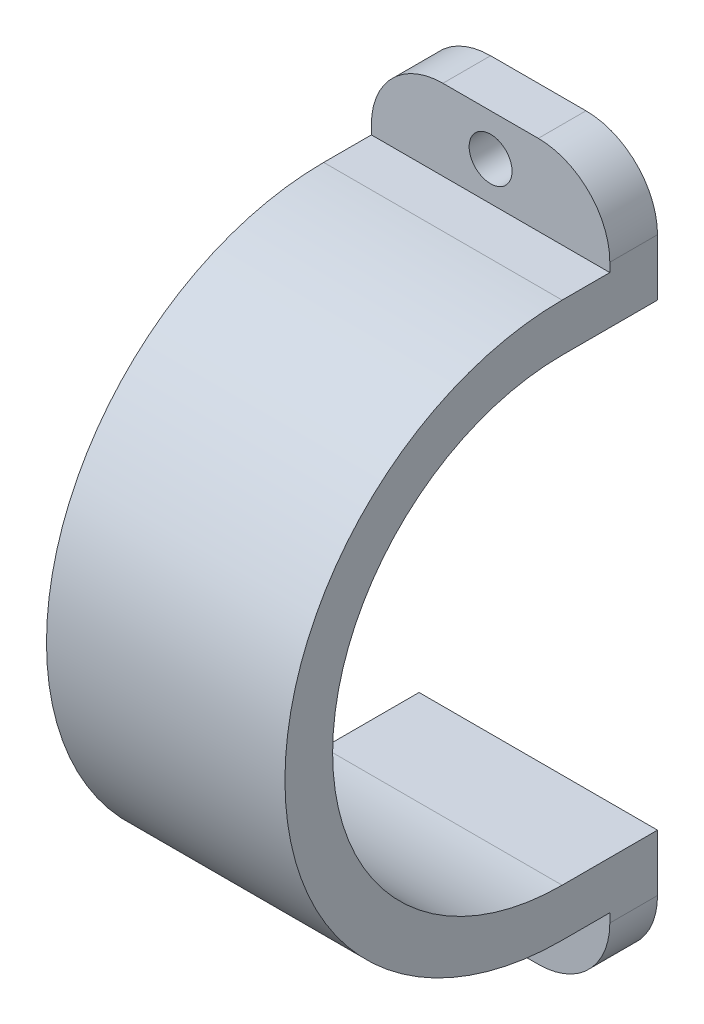
ISO-10303-21;
HEADER;
FILE_DESCRIPTION(('STEP AP214'),'2;1');
FILE_NAME('part.step','',(''),(''),'','','');
FILE_SCHEMA(('AUTOMOTIVE_DESIGN { 1 0 10303 214 1 1 1 1 }'));
ENDSEC;
DATA;
#1=APPLICATION_CONTEXT('core data for automotive mechanical design processes');
#2=APPLICATION_PROTOCOL_DEFINITION('international standard','automotive_design',2000,#1);
#3=PRODUCT_CONTEXT('',#1,'mechanical');
#4=PRODUCT('Part','Part','',(#3));
#5=PRODUCT_RELATED_PRODUCT_CATEGORY('part','',(#4));
#6=PRODUCT_DEFINITION_FORMATION('','',#4);
#7=PRODUCT_DEFINITION_CONTEXT('part definition',#1,'design');
#8=PRODUCT_DEFINITION('design','',#6,#7);
#9=PRODUCT_DEFINITION_SHAPE('','',#8);
#10=(LENGTH_UNIT() NAMED_UNIT(*) SI_UNIT(.MILLI.,.METRE.));
#11=(NAMED_UNIT(*) PLANE_ANGLE_UNIT() SI_UNIT($,.RADIAN.));
#12=(NAMED_UNIT(*) SI_UNIT($,.STERADIAN.) SOLID_ANGLE_UNIT());
#13=UNCERTAINTY_MEASURE_WITH_UNIT(LENGTH_MEASURE(1.E-05),#10,'distance_accuracy_value','');
#14=(GEOMETRIC_REPRESENTATION_CONTEXT(3) GLOBAL_UNCERTAINTY_ASSIGNED_CONTEXT((#13)) GLOBAL_UNIT_ASSIGNED_CONTEXT((#10,
#11,#12)) REPRESENTATION_CONTEXT('',''));
#15=CARTESIAN_POINT('',(0.,0.,0.));
#16=DIRECTION('',(0.,0.,1.));
#17=DIRECTION('',(1.,0.,0.));
#18=AXIS2_PLACEMENT_3D('',#15,#16,#17);
#19=CARTESIAN_POINT('',(20.,23.25,29.5));
#20=DIRECTION('',(0.,0.,-1.));
#21=DIRECTION('',(0.,1.,0.));
#22=AXIS2_PLACEMENT_3D('',#19,#20,#21);
#23=PLANE('',#22);
#24=DIRECTION('',(0.,-1.,0.));
#25=VECTOR('',#24,1.);
#26=CARTESIAN_POINT('',(20.,23.25,29.5));
#27=LINE('',#26,#25);
#28=CARTESIAN_POINT('',(20.,24.,29.5));
#29=VERTEX_POINT('',#28);
#30=CARTESIAN_POINT('',(20.,23.25,29.5));
#31=VERTEX_POINT('',#30);
#32=EDGE_CURVE('E161',#29,#31,#27,.T.);
#33=ORIENTED_EDGE('',*,*,#32,.F.);
#34=CARTESIAN_POINT('',(14.,24.,29.5));
#35=DIRECTION('',(0.,0.,-1.));
#36=DIRECTION('',(0.,1.,0.));
#37=AXIS2_PLACEMENT_3D('',#34,#35,#36);
#38=CIRCLE('',#37,6.);
#39=CARTESIAN_POINT('',(14.,30.,29.5));
#40=VERTEX_POINT('',#39);
#41=EDGE_CURVE('E201',#29,#40,#38,.F.);
#42=ORIENTED_EDGE('',*,*,#41,.T.);
#43=DIRECTION('',(-1.,0.,0.));
#44=VECTOR('',#43,1.);
#45=CARTESIAN_POINT('',(20.,30.,29.5));
#46=LINE('',#45,#44);
#47=CARTESIAN_POINT('',(6.,30.,29.5));
#48=VERTEX_POINT('',#47);
#49=EDGE_CURVE('E287',#40,#48,#46,.T.);
#50=ORIENTED_EDGE('',*,*,#49,.T.);
#51=CARTESIAN_POINT('',(6.,24.,29.5));
#52=DIRECTION('',(0.,0.,-1.));
#53=DIRECTION('',(0.,1.,0.));
#54=AXIS2_PLACEMENT_3D('',#51,#52,#53);
#55=CIRCLE('',#54,6.);
#56=CARTESIAN_POINT('',(0.,24.,29.5));
#57=VERTEX_POINT('',#56);
#58=EDGE_CURVE('E198',#48,#57,#55,.F.);
#59=ORIENTED_EDGE('',*,*,#58,.T.);
#60=DIRECTION('',(0.,-1.,0.));
#61=VECTOR('',#60,1.);
#62=CARTESIAN_POINT('',(0.,23.25,29.5));
#63=LINE('',#62,#61);
#64=CARTESIAN_POINT('',(0.,23.25,29.5));
#65=VERTEX_POINT('',#64);
#66=EDGE_CURVE('E184',#57,#65,#63,.T.);
#67=ORIENTED_EDGE('',*,*,#66,.T.);
#68=DIRECTION('',(-1.,0.,0.));
#69=VECTOR('',#68,1.);
#70=CARTESIAN_POINT('',(20.,23.25,29.5));
#71=LINE('',#70,#69);
#72=EDGE_CURVE('E176',#31,#65,#71,.T.);
#73=ORIENTED_EDGE('',*,*,#72,.F.);
#74=EDGE_LOOP('',(#33,#42,#50,#59,#67,#73));
#75=FACE_BOUND('',#74,.T.);
#76=CARTESIAN_POINT('',(10.,26.5,29.5));
#77=DIRECTION('',(0.,0.,1.));
#78=DIRECTION('',(1.,0.,0.));
#79=AXIS2_PLACEMENT_3D('',#76,#77,#78);
#80=CIRCLE('',#79,1.8);
#81=CARTESIAN_POINT('',(11.8,26.5,29.5));
#82=VERTEX_POINT('',#81);
#83=EDGE_CURVE('E511',#82,#82,#80,.T.);
#84=ORIENTED_EDGE('',*,*,#83,.F.);
#85=EDGE_LOOP('',(#84));
#86=FACE_BOUND('',#85,.T.);
#87=ADVANCED_FACE('F41',(#75,#86),#23,.F.);
#88=CARTESIAN_POINT('',(20.,23.25,33.5));
#89=DIRECTION('',(0.,-1.,0.));
#90=DIRECTION('',(0.,0.,-1.));
#91=AXIS2_PLACEMENT_3D('',#88,#89,#90);
#92=PLANE('',#91);
#93=DIRECTION('',(0.,0.,1.));
#94=VECTOR('',#93,1.);
#95=CARTESIAN_POINT('',(0.,23.25,33.5));
#96=LINE('',#95,#94);
#97=CARTESIAN_POINT('',(0.,23.25,33.5));
#98=VERTEX_POINT('',#97);
#99=EDGE_CURVE('E272',#65,#98,#96,.T.);
#100=ORIENTED_EDGE('',*,*,#99,.T.);
#101=DIRECTION('',(-1.,0.,0.));
#102=VECTOR('',#101,1.);
#103=CARTESIAN_POINT('',(20.,23.25,33.5));
#104=LINE('',#103,#102);
#105=CARTESIAN_POINT('',(20.,23.25,33.5));
#106=VERTEX_POINT('',#105);
#107=EDGE_CURVE('E178',#106,#98,#104,.T.);
#108=ORIENTED_EDGE('',*,*,#107,.F.);
#109=DIRECTION('',(0.,0.,1.));
#110=VECTOR('',#109,1.);
#111=CARTESIAN_POINT('',(20.,23.25,33.5));
#112=LINE('',#111,#110);
#113=EDGE_CURVE('E165',#31,#106,#112,.T.);
#114=ORIENTED_EDGE('',*,*,#113,.F.);
#115=ORIENTED_EDGE('',*,*,#72,.T.);
#116=EDGE_LOOP('',(#100,#108,#114,#115));
#117=FACE_BOUND('',#116,.T.);
#118=ADVANCED_FACE('F175',(#117),#92,.F.);
#119=CARTESIAN_POINT('',(20.,0.,33.5));
#120=DIRECTION('',(-1.,0.,0.));
#121=DIRECTION('',(0.,0.,1.));
#122=AXIS2_PLACEMENT_3D('',#119,#120,#121);
#123=CYLINDRICAL_SURFACE('',#122,23.25);
#124=CARTESIAN_POINT('',(0.,0.,33.5));
#125=DIRECTION('',(1.,0.,0.));
#126=DIRECTION('',(0.,0.,1.));
#127=AXIS2_PLACEMENT_3D('',#124,#125,#126);
#128=CIRCLE('',#127,23.25);
#129=CARTESIAN_POINT('',(0.,-23.25,33.5));
#130=VERTEX_POINT('',#129);
#131=EDGE_CURVE('E267',#98,#130,#128,.T.);
#132=ORIENTED_EDGE('',*,*,#131,.T.);
#133=DIRECTION('',(-1.,0.,0.));
#134=VECTOR('',#133,1.);
#135=CARTESIAN_POINT('',(20.,-23.25,33.5));
#136=LINE('',#135,#134);
#137=CARTESIAN_POINT('',(20.,-23.25,33.5));
#138=VERTEX_POINT('',#137);
#139=EDGE_CURVE('E193',#138,#130,#136,.T.);
#140=ORIENTED_EDGE('',*,*,#139,.F.);
#141=CARTESIAN_POINT('',(20.,0.,33.5));
#142=DIRECTION('',(1.,0.,0.));
#143=DIRECTION('',(0.,0.,1.));
#144=AXIS2_PLACEMENT_3D('',#141,#142,#143);
#145=CIRCLE('',#144,23.25);
#146=EDGE_CURVE('E180',#106,#138,#145,.T.);
#147=ORIENTED_EDGE('',*,*,#146,.F.);
#148=ORIENTED_EDGE('',*,*,#107,.T.);
#149=EDGE_LOOP('',(#132,#140,#147,#148));
#150=FACE_BOUND('',#149,.T.);
#151=ADVANCED_FACE('F334',(#150),#123,.T.);
#152=CARTESIAN_POINT('',(20.,-23.25,33.5));
#153=DIRECTION('',(0.,1.,0.));
#154=DIRECTION('',(0.,0.,1.));
#155=AXIS2_PLACEMENT_3D('',#152,#153,#154);
#156=PLANE('',#155);
#157=DIRECTION('',(0.,0.,-1.));
#158=VECTOR('',#157,1.);
#159=CARTESIAN_POINT('',(0.,-23.25,33.5));
#160=LINE('',#159,#158);
#161=CARTESIAN_POINT('',(0.,-23.25,29.5));
#162=VERTEX_POINT('',#161);
#163=EDGE_CURVE('E261',#130,#162,#160,.T.);
#164=ORIENTED_EDGE('',*,*,#163,.T.);
#165=DIRECTION('',(-1.,0.,0.));
#166=VECTOR('',#165,1.);
#167=CARTESIAN_POINT('',(20.,-23.25,29.5));
#168=LINE('',#167,#166);
#169=CARTESIAN_POINT('',(20.,-23.25,29.5));
#170=VERTEX_POINT('',#169);
#171=EDGE_CURVE('E249',#170,#162,#168,.T.);
#172=ORIENTED_EDGE('',*,*,#171,.F.);
#173=DIRECTION('',(0.,0.,-1.));
#174=VECTOR('',#173,1.);
#175=CARTESIAN_POINT('',(20.,-23.25,33.5));
#176=LINE('',#175,#174);
#177=EDGE_CURVE('E236',#138,#170,#176,.T.);
#178=ORIENTED_EDGE('',*,*,#177,.F.);
#179=ORIENTED_EDGE('',*,*,#139,.T.);
#180=EDGE_LOOP('',(#164,#172,#178,#179));
#181=FACE_BOUND('',#180,.T.);
#182=ADVANCED_FACE('F260',(#181),#156,.F.);
#183=CARTESIAN_POINT('',(20.,-23.25,29.5));
#184=DIRECTION('',(0.,0.,-1.));
#185=DIRECTION('',(0.,1.,0.));
#186=AXIS2_PLACEMENT_3D('',#183,#184,#185);
#187=PLANE('',#186);
#188=CARTESIAN_POINT('',(10.,-26.5,29.5));
#189=DIRECTION('',(0.,0.,1.));
#190=DIRECTION('',(1.,0.,0.));
#191=AXIS2_PLACEMENT_3D('',#188,#189,#190);
#192=CIRCLE('',#191,1.8);
#193=CARTESIAN_POINT('',(11.8,-26.5,29.5));
#194=VERTEX_POINT('',#193);
#195=EDGE_CURVE('E505',#194,#194,#192,.T.);
#196=ORIENTED_EDGE('',*,*,#195,.F.);
#197=EDGE_LOOP('',(#196));
#198=FACE_BOUND('',#197,.T.);
#199=DIRECTION('',(0.,-1.,0.));
#200=VECTOR('',#199,1.);
#201=CARTESIAN_POINT('',(0.,-23.25,29.5));
#202=LINE('',#201,#200);
#203=CARTESIAN_POINT('',(0.,-24.,29.5));
#204=VERTEX_POINT('',#203);
#205=EDGE_CURVE('E268',#162,#204,#202,.T.);
#206=ORIENTED_EDGE('',*,*,#205,.T.);
#207=CARTESIAN_POINT('',(6.,-24.,29.5));
#208=DIRECTION('',(0.,0.,-1.));
#209=DIRECTION('',(0.,1.,0.));
#210=AXIS2_PLACEMENT_3D('',#207,#208,#209);
#211=CIRCLE('',#210,6.);
#212=CARTESIAN_POINT('',(6.,-30.,29.5));
#213=VERTEX_POINT('',#212);
#214=EDGE_CURVE('E11',#204,#213,#211,.F.);
#215=ORIENTED_EDGE('',*,*,#214,.T.);
#216=DIRECTION('',(-1.,0.,0.));
#217=VECTOR('',#216,1.);
#218=CARTESIAN_POINT('',(20.,-30.,29.5));
#219=LINE('',#218,#217);
#220=CARTESIAN_POINT('',(14.,-30.,29.5));
#221=VERTEX_POINT('',#220);
#222=EDGE_CURVE('E231',#221,#213,#219,.T.);
#223=ORIENTED_EDGE('',*,*,#222,.F.);
#224=CARTESIAN_POINT('',(14.,-24.,29.5));
#225=DIRECTION('',(0.,0.,-1.));
#226=DIRECTION('',(0.,1.,0.));
#227=AXIS2_PLACEMENT_3D('',#224,#225,#226);
#228=CIRCLE('',#227,6.);
#229=CARTESIAN_POINT('',(20.,-24.,29.5));
#230=VERTEX_POINT('',#229);
#231=EDGE_CURVE('E49',#221,#230,#228,.F.);
#232=ORIENTED_EDGE('',*,*,#231,.T.);
#233=DIRECTION('',(0.,-1.,0.));
#234=VECTOR('',#233,1.);
#235=CARTESIAN_POINT('',(20.,-23.25,29.5));
#236=LINE('',#235,#234);
#237=EDGE_CURVE('E230',#170,#230,#236,.T.);
#238=ORIENTED_EDGE('',*,*,#237,.F.);
#239=ORIENTED_EDGE('',*,*,#171,.T.);
#240=EDGE_LOOP('',(#206,#215,#223,#232,#238,#239));
#241=FACE_BOUND('',#240,.T.);
#242=ADVANCED_FACE('F228',(#198,#241),#187,.F.);
#243=CARTESIAN_POINT('',(20.,-30.,29.5));
#244=DIRECTION('',(0.,1.,0.));
#245=DIRECTION('',(0.,0.,1.));
#246=AXIS2_PLACEMENT_3D('',#243,#244,#245);
#247=PLANE('',#246);
#248=ORIENTED_EDGE('',*,*,#222,.T.);
#249=DIRECTION('',(0.,0.,-1.));
#250=VECTOR('',#249,1.);
#251=CARTESIAN_POINT('',(6.,-30.,29.5));
#252=LINE('',#251,#250);
#253=CARTESIAN_POINT('',(6.,-30.,25.5));
#254=VERTEX_POINT('',#253);
#255=EDGE_CURVE('E219',#213,#254,#252,.T.);
#256=ORIENTED_EDGE('',*,*,#255,.T.);
#257=DIRECTION('',(-1.,0.,0.));
#258=VECTOR('',#257,1.);
#259=CARTESIAN_POINT('',(20.,-30.,25.5));
#260=LINE('',#259,#258);
#261=CARTESIAN_POINT('',(14.,-30.,25.5));
#262=VERTEX_POINT('',#261);
#263=EDGE_CURVE('E243',#262,#254,#260,.T.);
#264=ORIENTED_EDGE('',*,*,#263,.F.);
#265=DIRECTION('',(0.,0.,-1.));
#266=VECTOR('',#265,1.);
#267=CARTESIAN_POINT('',(14.,-30.,29.5));
#268=LINE('',#267,#266);
#269=EDGE_CURVE('E61',#262,#221,#268,.F.);
#270=ORIENTED_EDGE('',*,*,#269,.T.);
#271=EDGE_LOOP('',(#248,#256,#264,#270));
#272=FACE_BOUND('',#271,.T.);
#273=ADVANCED_FACE('F245',(#272),#247,.F.);
#274=CARTESIAN_POINT('',(20.,-30.,25.5));
#275=DIRECTION('',(0.,0.,1.));
#276=DIRECTION('',(0.,-1.,0.));
#277=AXIS2_PLACEMENT_3D('',#274,#275,#276);
#278=PLANE('',#277);
#279=CARTESIAN_POINT('',(10.,-26.5,25.5));
#280=DIRECTION('',(0.,0.,1.));
#281=DIRECTION('',(0.,-1.,0.));
#282=AXIS2_PLACEMENT_3D('',#279,#280,#281);
#283=CIRCLE('',#282,1.8);
#284=CARTESIAN_POINT('',(10.,-28.3,25.5));
#285=VERTEX_POINT('',#284);
#286=EDGE_CURVE('E333',#285,#285,#283,.T.);
#287=ORIENTED_EDGE('',*,*,#286,.T.);
#288=EDGE_LOOP('',(#287));
#289=FACE_BOUND('',#288,.T.);
#290=ORIENTED_EDGE('',*,*,#263,.T.);
#291=CARTESIAN_POINT('',(6.,-24.,25.5));
#292=DIRECTION('',(0.,0.,1.));
#293=DIRECTION('',(0.,-1.,0.));
#294=AXIS2_PLACEMENT_3D('',#291,#292,#293);
#295=CIRCLE('',#294,6.);
#296=CARTESIAN_POINT('',(0.,-24.,25.5));
#297=VERTEX_POINT('',#296);
#298=EDGE_CURVE('E224',#254,#297,#295,.F.);
#299=ORIENTED_EDGE('',*,*,#298,.T.);
#300=DIRECTION('',(0.,1.,0.));
#301=VECTOR('',#300,1.);
#302=CARTESIAN_POINT('',(0.,-30.,25.5));
#303=LINE('',#302,#301);
#304=CARTESIAN_POINT('',(0.,-19.25,25.5));
#305=VERTEX_POINT('',#304);
#306=EDGE_CURVE('E270',#297,#305,#303,.T.);
#307=ORIENTED_EDGE('',*,*,#306,.T.);
#308=DIRECTION('',(-1.,0.,0.));
#309=VECTOR('',#308,1.);
#310=CARTESIAN_POINT('',(20.,-19.25,25.5));
#311=LINE('',#310,#309);
#312=CARTESIAN_POINT('',(20.,-19.25,25.5));
#313=VERTEX_POINT('',#312);
#314=EDGE_CURVE('E247',#313,#305,#311,.T.);
#315=ORIENTED_EDGE('',*,*,#314,.F.);
#316=DIRECTION('',(0.,1.,0.));
#317=VECTOR('',#316,1.);
#318=CARTESIAN_POINT('',(20.,-30.,25.5));
#319=LINE('',#318,#317);
#320=CARTESIAN_POINT('',(20.,-24.,25.5));
#321=VERTEX_POINT('',#320);
#322=EDGE_CURVE('E238',#321,#313,#319,.T.);
#323=ORIENTED_EDGE('',*,*,#322,.F.);
#324=CARTESIAN_POINT('',(14.,-24.,25.5));
#325=DIRECTION('',(0.,0.,1.));
#326=DIRECTION('',(0.,-1.,0.));
#327=AXIS2_PLACEMENT_3D('',#324,#325,#326);
#328=CIRCLE('',#327,6.);
#329=EDGE_CURVE('E222',#321,#262,#328,.F.);
#330=ORIENTED_EDGE('',*,*,#329,.T.);
#331=EDGE_LOOP('',(#290,#299,#307,#315,#323,#330));
#332=FACE_BOUND('',#331,.T.);
#333=ADVANCED_FACE('F242',(#289,#332),#278,.F.);
#334=CARTESIAN_POINT('',(20.,-19.25,25.5));
#335=DIRECTION('',(0.,-1.,0.));
#336=DIRECTION('',(0.,0.,-1.));
#337=AXIS2_PLACEMENT_3D('',#334,#335,#336);
#338=PLANE('',#337);
#339=DIRECTION('',(0.,0.,1.));
#340=VECTOR('',#339,1.);
#341=CARTESIAN_POINT('',(0.,-19.25,25.5));
#342=LINE('',#341,#340);
#343=CARTESIAN_POINT('',(0.,-19.25,33.5));
#344=VERTEX_POINT('',#343);
#345=EDGE_CURVE('E277',#305,#344,#342,.T.);
#346=ORIENTED_EDGE('',*,*,#345,.T.);
#347=DIRECTION('',(-1.,0.,0.));
#348=VECTOR('',#347,1.);
#349=CARTESIAN_POINT('',(20.,-19.25,33.5));
#350=LINE('',#349,#348);
#351=CARTESIAN_POINT('',(20.,-19.25,33.5));
#352=VERTEX_POINT('',#351);
#353=EDGE_CURVE('E252',#352,#344,#350,.T.);
#354=ORIENTED_EDGE('',*,*,#353,.F.);
#355=DIRECTION('',(0.,0.,1.));
#356=VECTOR('',#355,1.);
#357=CARTESIAN_POINT('',(20.,-19.25,25.5));
#358=LINE('',#357,#356);
#359=EDGE_CURVE('E339',#313,#352,#358,.T.);
#360=ORIENTED_EDGE('',*,*,#359,.F.);
#361=ORIENTED_EDGE('',*,*,#314,.T.);
#362=EDGE_LOOP('',(#346,#354,#360,#361));
#363=FACE_BOUND('',#362,.T.);
#364=ADVANCED_FACE('F341',(#363),#338,.F.);
#365=CARTESIAN_POINT('',(20.,0.,33.5));
#366=DIRECTION('',(-1.,0.,0.));
#367=DIRECTION('',(0.,0.,1.));
#368=AXIS2_PLACEMENT_3D('',#365,#366,#367);
#369=CYLINDRICAL_SURFACE('',#368,19.25);
#370=CARTESIAN_POINT('',(0.,0.,33.5));
#371=DIRECTION('',(-1.,0.,0.));
#372=DIRECTION('',(0.,0.,-1.));
#373=AXIS2_PLACEMENT_3D('',#370,#371,#372);
#374=CIRCLE('',#373,19.25);
#375=CARTESIAN_POINT('',(0.,19.25,33.5));
#376=VERTEX_POINT('',#375);
#377=EDGE_CURVE('E279',#344,#376,#374,.T.);
#378=ORIENTED_EDGE('',*,*,#377,.T.);
#379=DIRECTION('',(-1.,0.,0.));
#380=VECTOR('',#379,1.);
#381=CARTESIAN_POINT('',(20.,19.25,33.5));
#382=LINE('',#381,#380);
#383=CARTESIAN_POINT('',(20.,19.25,33.5));
#384=VERTEX_POINT('',#383);
#385=EDGE_CURVE('E298',#384,#376,#382,.T.);
#386=ORIENTED_EDGE('',*,*,#385,.F.);
#387=CARTESIAN_POINT('',(20.,0.,33.5));
#388=DIRECTION('',(-1.,0.,0.));
#389=DIRECTION('',(0.,0.,-1.));
#390=AXIS2_PLACEMENT_3D('',#387,#388,#389);
#391=CIRCLE('',#390,19.25);
#392=EDGE_CURVE('E308',#352,#384,#391,.T.);
#393=ORIENTED_EDGE('',*,*,#392,.F.);
#394=ORIENTED_EDGE('',*,*,#353,.T.);
#395=EDGE_LOOP('',(#378,#386,#393,#394));
#396=FACE_BOUND('',#395,.T.);
#397=ADVANCED_FACE('F306',(#396),#369,.F.);
#398=CARTESIAN_POINT('',(20.,19.25,25.5));
#399=DIRECTION('',(0.,1.,0.));
#400=DIRECTION('',(0.,0.,1.));
#401=AXIS2_PLACEMENT_3D('',#398,#399,#400);
#402=PLANE('',#401);
#403=DIRECTION('',(0.,0.,-1.));
#404=VECTOR('',#403,1.);
#405=CARTESIAN_POINT('',(0.,19.25,25.5));
#406=LINE('',#405,#404);
#407=CARTESIAN_POINT('',(0.,19.25,25.5));
#408=VERTEX_POINT('',#407);
#409=EDGE_CURVE('E281',#376,#408,#406,.T.);
#410=ORIENTED_EDGE('',*,*,#409,.T.);
#411=DIRECTION('',(-1.,0.,0.));
#412=VECTOR('',#411,1.);
#413=CARTESIAN_POINT('',(20.,19.25,25.5));
#414=LINE('',#413,#412);
#415=CARTESIAN_POINT('',(20.,19.25,25.5));
#416=VERTEX_POINT('',#415);
#417=EDGE_CURVE('E294',#416,#408,#414,.T.);
#418=ORIENTED_EDGE('',*,*,#417,.F.);
#419=DIRECTION('',(0.,0.,-1.));
#420=VECTOR('',#419,1.);
#421=CARTESIAN_POINT('',(20.,19.25,25.5));
#422=LINE('',#421,#420);
#423=EDGE_CURVE('E326',#384,#416,#422,.T.);
#424=ORIENTED_EDGE('',*,*,#423,.F.);
#425=ORIENTED_EDGE('',*,*,#385,.T.);
#426=EDGE_LOOP('',(#410,#418,#424,#425));
#427=FACE_BOUND('',#426,.T.);
#428=ADVANCED_FACE('F317',(#427),#402,.F.);
#429=CARTESIAN_POINT('',(20.,30.,25.5));
#430=DIRECTION('',(0.,0.,1.));
#431=DIRECTION('',(0.,-1.,0.));
#432=AXIS2_PLACEMENT_3D('',#429,#430,#431);
#433=PLANE('',#432);
#434=CARTESIAN_POINT('',(10.,26.5,25.5));
#435=DIRECTION('',(0.,0.,1.));
#436=DIRECTION('',(0.,-1.,0.));
#437=AXIS2_PLACEMENT_3D('',#434,#435,#436);
#438=CIRCLE('',#437,1.8);
#439=CARTESIAN_POINT('',(10.,24.7,25.5));
#440=VERTEX_POINT('',#439);
#441=EDGE_CURVE('E506',#440,#440,#438,.T.);
#442=ORIENTED_EDGE('',*,*,#441,.T.);
#443=EDGE_LOOP('',(#442));
#444=FACE_BOUND('',#443,.T.);
#445=DIRECTION('',(-1.,0.,0.));
#446=VECTOR('',#445,1.);
#447=CARTESIAN_POINT('',(20.,30.,25.5));
#448=LINE('',#447,#446);
#449=CARTESIAN_POINT('',(14.,30.,25.5));
#450=VERTEX_POINT('',#449);
#451=CARTESIAN_POINT('',(6.,30.,25.5));
#452=VERTEX_POINT('',#451);
#453=EDGE_CURVE('E290',#450,#452,#448,.T.);
#454=ORIENTED_EDGE('',*,*,#453,.F.);
#455=CARTESIAN_POINT('',(14.,24.,25.5));
#456=DIRECTION('',(0.,0.,1.));
#457=DIRECTION('',(0.,-1.,0.));
#458=AXIS2_PLACEMENT_3D('',#455,#456,#457);
#459=CIRCLE('',#458,6.);
#460=CARTESIAN_POINT('',(20.,24.,25.5));
#461=VERTEX_POINT('',#460);
#462=EDGE_CURVE('E211',#450,#461,#459,.F.);
#463=ORIENTED_EDGE('',*,*,#462,.T.);
#464=DIRECTION('',(0.,1.,0.));
#465=VECTOR('',#464,1.);
#466=CARTESIAN_POINT('',(20.,30.,25.5));
#467=LINE('',#466,#465);
#468=EDGE_CURVE('E291',#416,#461,#467,.T.);
#469=ORIENTED_EDGE('',*,*,#468,.F.);
#470=ORIENTED_EDGE('',*,*,#417,.T.);
#471=DIRECTION('',(0.,1.,0.));
#472=VECTOR('',#471,1.);
#473=CARTESIAN_POINT('',(0.,30.,25.5));
#474=LINE('',#473,#472);
#475=CARTESIAN_POINT('',(0.,24.,25.5));
#476=VERTEX_POINT('',#475);
#477=EDGE_CURVE('E171',#408,#476,#474,.T.);
#478=ORIENTED_EDGE('',*,*,#477,.T.);
#479=CARTESIAN_POINT('',(6.,24.,25.5));
#480=DIRECTION('',(0.,0.,1.));
#481=DIRECTION('',(0.,-1.,0.));
#482=AXIS2_PLACEMENT_3D('',#479,#480,#481);
#483=CIRCLE('',#482,6.);
#484=EDGE_CURVE('E208',#476,#452,#483,.F.);
#485=ORIENTED_EDGE('',*,*,#484,.T.);
#486=EDGE_LOOP('',(#454,#463,#469,#470,#478,#485));
#487=FACE_BOUND('',#486,.T.);
#488=ADVANCED_FACE('F322',(#444,#487),#433,.F.);
#489=CARTESIAN_POINT('',(20.,30.,29.5));
#490=DIRECTION('',(0.,-1.,0.));
#491=DIRECTION('',(0.,0.,-1.));
#492=AXIS2_PLACEMENT_3D('',#489,#490,#491);
#493=PLANE('',#492);
#494=ORIENTED_EDGE('',*,*,#49,.F.);
#495=DIRECTION('',(0.,0.,1.));
#496=VECTOR('',#495,1.);
#497=CARTESIAN_POINT('',(14.,30.,25.5));
#498=LINE('',#497,#496);
#499=EDGE_CURVE('E206',#40,#450,#498,.F.);
#500=ORIENTED_EDGE('',*,*,#499,.T.);
#501=ORIENTED_EDGE('',*,*,#453,.T.);
#502=DIRECTION('',(0.,0.,1.));
#503=VECTOR('',#502,1.);
#504=CARTESIAN_POINT('',(6.,30.,29.5));
#505=LINE('',#504,#503);
#506=EDGE_CURVE('E203',#452,#48,#505,.T.);
#507=ORIENTED_EDGE('',*,*,#506,.T.);
#508=EDGE_LOOP('',(#494,#500,#501,#507));
#509=FACE_BOUND('',#508,.T.);
#510=ADVANCED_FACE('F374',(#509),#493,.F.);
#511=CARTESIAN_POINT('',(20.,0.,33.5));
#512=DIRECTION('',(1.,0.,0.));
#513=DIRECTION('',(0.,0.,-1.));
#514=AXIS2_PLACEMENT_3D('',#511,#512,#513);
#515=PLANE('',#514);
#516=ORIENTED_EDGE('',*,*,#468,.T.);
#517=DIRECTION('',(0.,0.,1.));
#518=VECTOR('',#517,1.);
#519=CARTESIAN_POINT('',(20.,24.,29.5));
#520=LINE('',#519,#518);
#521=EDGE_CURVE('E168',#461,#29,#520,.T.);
#522=ORIENTED_EDGE('',*,*,#521,.T.);
#523=ORIENTED_EDGE('',*,*,#32,.T.);
#524=ORIENTED_EDGE('',*,*,#113,.T.);
#525=ORIENTED_EDGE('',*,*,#146,.T.);
#526=ORIENTED_EDGE('',*,*,#177,.T.);
#527=ORIENTED_EDGE('',*,*,#237,.T.);
#528=DIRECTION('',(0.,0.,-1.));
#529=VECTOR('',#528,1.);
#530=CARTESIAN_POINT('',(20.,-24.,25.5));
#531=LINE('',#530,#529);
#532=EDGE_CURVE('E187',#230,#321,#531,.T.);
#533=ORIENTED_EDGE('',*,*,#532,.T.);
#534=ORIENTED_EDGE('',*,*,#322,.T.);
#535=ORIENTED_EDGE('',*,*,#359,.T.);
#536=ORIENTED_EDGE('',*,*,#392,.T.);
#537=ORIENTED_EDGE('',*,*,#423,.T.);
#538=EDGE_LOOP('',(#516,#522,#523,#524,#525,#526,#527,#533,#534,#535,#536,#537));
#539=FACE_BOUND('',#538,.T.);
#540=ADVANCED_FACE('F164',(#539),#515,.T.);
#541=CARTESIAN_POINT('',(0.,0.,33.5));
#542=DIRECTION('',(1.,0.,0.));
#543=DIRECTION('',(0.,0.,-1.));
#544=AXIS2_PLACEMENT_3D('',#541,#542,#543);
#545=PLANE('',#544);
#546=ORIENTED_EDGE('',*,*,#66,.F.);
#547=DIRECTION('',(0.,0.,1.));
#548=VECTOR('',#547,1.);
#549=CARTESIAN_POINT('',(0.,24.,33.5));
#550=LINE('',#549,#548);
#551=EDGE_CURVE('E215',#57,#476,#550,.F.);
#552=ORIENTED_EDGE('',*,*,#551,.T.);
#553=ORIENTED_EDGE('',*,*,#477,.F.);
#554=ORIENTED_EDGE('',*,*,#409,.F.);
#555=ORIENTED_EDGE('',*,*,#377,.F.);
#556=ORIENTED_EDGE('',*,*,#345,.F.);
#557=ORIENTED_EDGE('',*,*,#306,.F.);
#558=DIRECTION('',(0.,0.,-1.));
#559=VECTOR('',#558,1.);
#560=CARTESIAN_POINT('',(0.,-24.,33.5));
#561=LINE('',#560,#559);
#562=EDGE_CURVE('E213',#297,#204,#561,.F.);
#563=ORIENTED_EDGE('',*,*,#562,.T.);
#564=ORIENTED_EDGE('',*,*,#205,.F.);
#565=ORIENTED_EDGE('',*,*,#163,.F.);
#566=ORIENTED_EDGE('',*,*,#131,.F.);
#567=ORIENTED_EDGE('',*,*,#99,.F.);
#568=EDGE_LOOP('',(#546,#552,#553,#554,#555,#556,#557,#563,#564,#565,#566,#567));
#569=FACE_BOUND('',#568,.T.);
#570=ADVANCED_FACE('F266',(#569),#545,.F.);
#571=CARTESIAN_POINT('',(10.,-26.5,29.5));
#572=DIRECTION('',(0.,0.,1.));
#573=DIRECTION('',(1.,0.,0.));
#574=AXIS2_PLACEMENT_3D('',#571,#572,#573);
#575=CYLINDRICAL_SURFACE('',#574,1.8);
#576=ORIENTED_EDGE('',*,*,#286,.F.);
#577=EDGE_LOOP('',(#576));
#578=FACE_BOUND('',#577,.T.);
#579=ORIENTED_EDGE('',*,*,#195,.T.);
#580=EDGE_LOOP('',(#579));
#581=FACE_BOUND('',#580,.T.);
#582=ADVANCED_FACE('F368',(#578,#581),#575,.F.);
#583=CARTESIAN_POINT('',(10.,26.5,29.5));
#584=DIRECTION('',(0.,0.,1.));
#585=DIRECTION('',(1.,0.,0.));
#586=AXIS2_PLACEMENT_3D('',#583,#584,#585);
#587=CYLINDRICAL_SURFACE('',#586,1.8);
#588=ORIENTED_EDGE('',*,*,#441,.F.);
#589=EDGE_LOOP('',(#588));
#590=FACE_BOUND('',#589,.T.);
#591=ORIENTED_EDGE('',*,*,#83,.T.);
#592=EDGE_LOOP('',(#591));
#593=FACE_BOUND('',#592,.T.);
#594=ADVANCED_FACE('F363',(#590,#593),#587,.F.);
#595=CARTESIAN_POINT('',(14.,24.,33.5));
#596=DIRECTION('',(0.,0.,-1.));
#597=DIRECTION('',(-1.,0.,0.));
#598=AXIS2_PLACEMENT_3D('',#595,#596,#597);
#599=CYLINDRICAL_SURFACE('',#598,6.);
#600=ORIENTED_EDGE('',*,*,#462,.F.);
#601=ORIENTED_EDGE('',*,*,#499,.F.);
#602=ORIENTED_EDGE('',*,*,#41,.F.);
#603=ORIENTED_EDGE('',*,*,#521,.F.);
#604=EDGE_LOOP('',(#600,#601,#602,#603));
#605=FACE_BOUND('',#604,.T.);
#606=ADVANCED_FACE('F351',(#605),#599,.T.);
#607=CARTESIAN_POINT('',(6.,24.,29.5));
#608=DIRECTION('',(0.,0.,1.));
#609=DIRECTION('',(1.,0.,0.));
#610=AXIS2_PLACEMENT_3D('',#607,#608,#609);
#611=CYLINDRICAL_SURFACE('',#610,6.);
#612=ORIENTED_EDGE('',*,*,#484,.F.);
#613=ORIENTED_EDGE('',*,*,#551,.F.);
#614=ORIENTED_EDGE('',*,*,#58,.F.);
#615=ORIENTED_EDGE('',*,*,#506,.F.);
#616=EDGE_LOOP('',(#612,#613,#614,#615));
#617=FACE_BOUND('',#616,.T.);
#618=ADVANCED_FACE('F346',(#617),#611,.T.);
#619=CARTESIAN_POINT('',(6.,-24.,29.5));
#620=DIRECTION('',(0.,0.,-1.));
#621=DIRECTION('',(-1.,0.,0.));
#622=AXIS2_PLACEMENT_3D('',#619,#620,#621);
#623=CYLINDRICAL_SURFACE('',#622,6.);
#624=ORIENTED_EDGE('',*,*,#214,.F.);
#625=ORIENTED_EDGE('',*,*,#562,.F.);
#626=ORIENTED_EDGE('',*,*,#298,.F.);
#627=ORIENTED_EDGE('',*,*,#255,.F.);
#628=EDGE_LOOP('',(#624,#625,#626,#627));
#629=FACE_BOUND('',#628,.T.);
#630=ADVANCED_FACE('F344',(#629),#623,.T.);
#631=CARTESIAN_POINT('',(14.,-24.,33.5));
#632=DIRECTION('',(0.,0.,1.));
#633=DIRECTION('',(1.,0.,0.));
#634=AXIS2_PLACEMENT_3D('',#631,#632,#633);
#635=CYLINDRICAL_SURFACE('',#634,6.);
#636=ORIENTED_EDGE('',*,*,#231,.F.);
#637=ORIENTED_EDGE('',*,*,#269,.F.);
#638=ORIENTED_EDGE('',*,*,#329,.F.);
#639=ORIENTED_EDGE('',*,*,#532,.F.);
#640=EDGE_LOOP('',(#636,#637,#638,#639));
#641=FACE_BOUND('',#640,.T.);
#642=ADVANCED_FACE('F43',(#641),#635,.T.);
#643=CLOSED_SHELL('',(#87,#118,#151,#182,#242,#273,#333,#364,#397,#428,#488,#510,#540,#570,#582,
#594,#606,#618,#630,#642));
#644=MANIFOLD_SOLID_BREP('B2',#643);
#645=ADVANCED_BREP_SHAPE_REPRESENTATION('',(#18,#644),#14);
#646=SHAPE_DEFINITION_REPRESENTATION(#9,#645);
ENDSEC;
END-ISO-10303-21;
